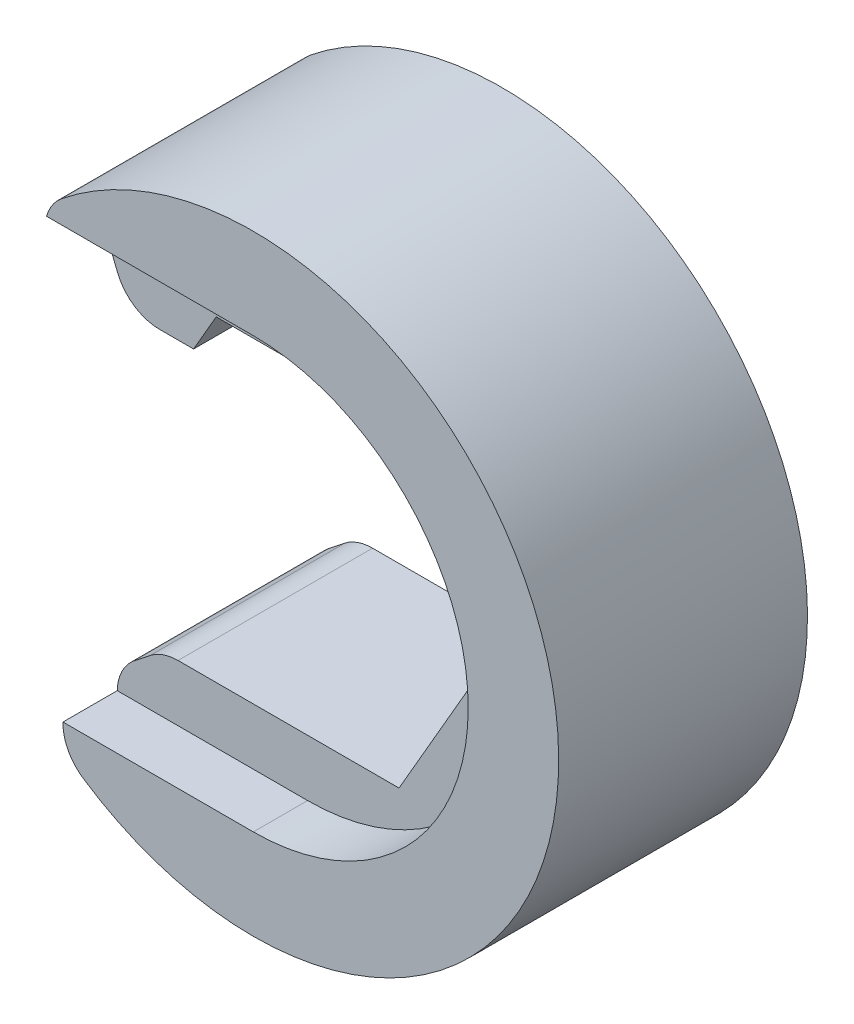
ISO-10303-21;
HEADER;
FILE_DESCRIPTION(('STEP AP214'),'2;1');
FILE_NAME('part.step','',(''),(''),'','','');
FILE_SCHEMA(('AUTOMOTIVE_DESIGN { 1 0 10303 214 1 1 1 1 }'));
ENDSEC;
DATA;
#1=APPLICATION_CONTEXT('core data for automotive mechanical design processes');
#2=APPLICATION_PROTOCOL_DEFINITION('international standard','automotive_design',2000,#1);
#3=PRODUCT_CONTEXT('',#1,'mechanical');
#4=PRODUCT('Part','Part','',(#3));
#5=PRODUCT_RELATED_PRODUCT_CATEGORY('part','',(#4));
#6=PRODUCT_DEFINITION_FORMATION('','',#4);
#7=PRODUCT_DEFINITION_CONTEXT('part definition',#1,'design');
#8=PRODUCT_DEFINITION('design','',#6,#7);
#9=PRODUCT_DEFINITION_SHAPE('','',#8);
#10=(LENGTH_UNIT() NAMED_UNIT(*) SI_UNIT(.MILLI.,.METRE.));
#11=(NAMED_UNIT(*) PLANE_ANGLE_UNIT() SI_UNIT($,.RADIAN.));
#12=(NAMED_UNIT(*) SI_UNIT($,.STERADIAN.) SOLID_ANGLE_UNIT());
#13=UNCERTAINTY_MEASURE_WITH_UNIT(LENGTH_MEASURE(1.E-05),#10,'distance_accuracy_value','');
#14=(GEOMETRIC_REPRESENTATION_CONTEXT(3) GLOBAL_UNCERTAINTY_ASSIGNED_CONTEXT((#13)) GLOBAL_UNIT_ASSIGNED_CONTEXT((#10,
#11,#12)) REPRESENTATION_CONTEXT('',''));
#15=CARTESIAN_POINT('',(0.,0.,0.));
#16=DIRECTION('',(0.,0.,1.));
#17=DIRECTION('',(1.,0.,0.));
#18=AXIS2_PLACEMENT_3D('',#15,#16,#17);
#19=CARTESIAN_POINT('',(-2.50571573989456,-0.998277955445095,4.3));
#20=DIRECTION('',(0.928988249422823,0.370109216899982,0.));
#21=DIRECTION('',(-0.370109216899982,0.928988249422823,0.));
#22=AXIS2_PLACEMENT_3D('',#19,#20,#21);
#23=PLANE('',#22);
#24=DIRECTION('',(0.370109216899982,-0.928988249422823,0.));
#25=VECTOR('',#24,1.);
#26=CARTESIAN_POINT('',(-2.50571573989456,-0.998277955445095,0.));
#27=LINE('',#26,#25);
#28=CARTESIAN_POINT('',(-4.53902162152533,4.10539735245127,0.));
#29=VERTEX_POINT('',#28);
#30=CARTESIAN_POINT('',(-4.20375501318334,3.26386537931558,0.));
#31=VERTEX_POINT('',#30);
#32=EDGE_CURVE('E164',#29,#31,#27,.T.);
#33=ORIENTED_EDGE('',*,*,#32,.T.);
#34=DIRECTION('',(0.,0.,-1.));
#35=VECTOR('',#34,1.);
#36=CARTESIAN_POINT('',(-4.20375501318334,3.26386537931558,4.3));
#37=LINE('',#36,#35);
#38=CARTESIAN_POINT('',(-4.20375501318334,3.26386537931558,4.3));
#39=VERTEX_POINT('',#38);
#40=EDGE_CURVE('E271',#31,#39,#37,.F.);
#41=ORIENTED_EDGE('',*,*,#40,.T.);
#42=DIRECTION('',(0.370109216899982,-0.928988249422823,0.));
#43=VECTOR('',#42,1.);
#44=CARTESIAN_POINT('',(-2.50571573989456,-0.998277955445095,4.3));
#45=LINE('',#44,#43);
#46=CARTESIAN_POINT('',(-4.53902162152533,4.10539735245127,4.3));
#47=VERTEX_POINT('',#46);
#48=EDGE_CURVE('E187',#47,#39,#45,.T.);
#49=ORIENTED_EDGE('',*,*,#48,.F.);
#50=DIRECTION('',(0.,0.,-1.));
#51=VECTOR('',#50,1.);
#52=CARTESIAN_POINT('',(-4.53902162152533,4.10539735245127,4.3));
#53=LINE('',#52,#51);
#54=EDGE_CURVE('E268',#47,#29,#53,.T.);
#55=ORIENTED_EDGE('',*,*,#54,.T.);
#56=EDGE_LOOP('',(#33,#41,#49,#55));
#57=FACE_BOUND('',#56,.T.);
#58=ADVANCED_FACE('F36',(#57),#23,.F.);
#59=CARTESIAN_POINT('',(0.,2.63397459621556,4.3));
#60=DIRECTION('',(0.,-1.,0.));
#61=DIRECTION('',(0.,0.,-1.));
#62=AXIS2_PLACEMENT_3D('',#59,#60,#61);
#63=PLANE('',#62);
#64=DIRECTION('',(-1.,0.,0.));
#65=VECTOR('',#64,1.);
#66=CARTESIAN_POINT('',(0.,2.63397459621556,4.3));
#67=LINE('',#66,#65);
#68=CARTESIAN_POINT('',(-2.52072594216372,2.63397459621556,4.3));
#69=VERTEX_POINT('',#68);
#70=CARTESIAN_POINT('',(-3.27476676376052,2.63397459621556,4.3));
#71=VERTEX_POINT('',#70);
#72=EDGE_CURVE('E190',#69,#71,#67,.T.);
#73=ORIENTED_EDGE('',*,*,#72,.T.);
#74=DIRECTION('',(0.,0.,-1.));
#75=VECTOR('',#74,1.);
#76=CARTESIAN_POINT('',(-3.27476676376052,2.63397459621556,0.));
#77=LINE('',#76,#75);
#78=CARTESIAN_POINT('',(-3.27476676376052,2.63397459621556,0.));
#79=VERTEX_POINT('',#78);
#80=EDGE_CURVE('E265',#71,#79,#77,.T.);
#81=ORIENTED_EDGE('',*,*,#80,.T.);
#82=DIRECTION('',(-1.,0.,0.));
#83=VECTOR('',#82,1.);
#84=CARTESIAN_POINT('',(0.,2.63397459621556,0.));
#85=LINE('',#84,#83);
#86=CARTESIAN_POINT('',(-2.52072594216372,2.63397459621556,0.));
#87=VERTEX_POINT('',#86);
#88=EDGE_CURVE('E213',#87,#79,#85,.T.);
#89=ORIENTED_EDGE('',*,*,#88,.F.);
#90=DIRECTION('',(0.,0.,-1.));
#91=VECTOR('',#90,1.);
#92=CARTESIAN_POINT('',(-2.52072594216372,2.63397459621556,4.3));
#93=LINE('',#92,#91);
#94=EDGE_CURVE('E240',#69,#87,#93,.T.);
#95=ORIENTED_EDGE('',*,*,#94,.F.);
#96=EDGE_LOOP('',(#73,#81,#89,#95));
#97=FACE_BOUND('',#96,.T.);
#98=ADVANCED_FACE('F305',(#97),#63,.T.);
#99=CARTESIAN_POINT('',(-3.03108891324555,1.75000000000003,4.3));
#100=DIRECTION('',(0.866025403784436,-0.500000000000004,0.));
#101=DIRECTION('',(0.500000000000004,0.866025403784436,0.));
#102=AXIS2_PLACEMENT_3D('',#99,#100,#101);
#103=PLANE('',#102);
#104=DIRECTION('',(-0.500000000000004,-0.866025403784436,0.));
#105=VECTOR('',#104,1.);
#106=CARTESIAN_POINT('',(-3.03108891324555,1.75000000000003,0.));
#107=LINE('',#106,#105);
#108=CARTESIAN_POINT('',(-2.02072594216371,3.5,0.));
#109=VERTEX_POINT('',#108);
#110=EDGE_CURVE('E216',#109,#87,#107,.T.);
#111=ORIENTED_EDGE('',*,*,#110,.F.);
#112=DIRECTION('',(0.,0.,-1.));
#113=VECTOR('',#112,1.);
#114=CARTESIAN_POINT('',(-2.02072594216371,3.5,4.3));
#115=LINE('',#114,#113);
#116=CARTESIAN_POINT('',(-2.02072594216371,3.5,4.3));
#117=VERTEX_POINT('',#116);
#118=EDGE_CURVE('E238',#117,#109,#115,.T.);
#119=ORIENTED_EDGE('',*,*,#118,.F.);
#120=DIRECTION('',(-0.500000000000004,-0.866025403784436,0.));
#121=VECTOR('',#120,1.);
#122=CARTESIAN_POINT('',(-3.03108891324555,1.75000000000003,4.3));
#123=LINE('',#122,#121);
#124=EDGE_CURVE('E193',#117,#69,#123,.T.);
#125=ORIENTED_EDGE('',*,*,#124,.T.);
#126=ORIENTED_EDGE('',*,*,#94,.T.);
#127=EDGE_LOOP('',(#111,#119,#125,#126));
#128=FACE_BOUND('',#127,.T.);
#129=ADVANCED_FACE('F310',(#128),#103,.T.);
#130=CARTESIAN_POINT('',(0.,3.5,4.3));
#131=DIRECTION('',(0.,1.,0.));
#132=DIRECTION('',(0.,0.,1.));
#133=AXIS2_PLACEMENT_3D('',#130,#131,#132);
#134=PLANE('',#133);
#135=DIRECTION('',(1.,0.,0.));
#136=VECTOR('',#135,1.);
#137=CARTESIAN_POINT('',(0.,3.5,0.));
#138=LINE('',#137,#136);
#139=CARTESIAN_POINT('',(2.02072594216368,3.5,0.));
#140=VERTEX_POINT('',#139);
#141=EDGE_CURVE('E219',#109,#140,#138,.T.);
#142=ORIENTED_EDGE('',*,*,#141,.T.);
#143=DIRECTION('',(0.,0.,-1.));
#144=VECTOR('',#143,1.);
#145=CARTESIAN_POINT('',(2.02072594216368,3.5,4.3));
#146=LINE('',#145,#144);
#147=CARTESIAN_POINT('',(2.02072594216368,3.5,4.3));
#148=VERTEX_POINT('',#147);
#149=EDGE_CURVE('E235',#148,#140,#146,.T.);
#150=ORIENTED_EDGE('',*,*,#149,.F.);
#151=DIRECTION('',(1.,0.,0.));
#152=VECTOR('',#151,1.);
#153=CARTESIAN_POINT('',(0.,3.5,4.3));
#154=LINE('',#153,#152);
#155=EDGE_CURVE('E196',#117,#148,#154,.T.);
#156=ORIENTED_EDGE('',*,*,#155,.F.);
#157=ORIENTED_EDGE('',*,*,#118,.T.);
#158=EDGE_LOOP('',(#142,#150,#156,#157));
#159=FACE_BOUND('',#158,.T.);
#160=ADVANCED_FACE('F315',(#159),#134,.F.);
#161=CARTESIAN_POINT('',(3.03108891324552,1.74999999999999,4.3));
#162=DIRECTION('',(0.866025403784439,0.499999999999998,0.));
#163=DIRECTION('',(-0.499999999999998,0.86602540378444,0.));
#164=AXIS2_PLACEMENT_3D('',#161,#162,#163);
#165=PLANE('',#164);
#166=DIRECTION('',(0.499999999999998,-0.86602540378444,0.));
#167=VECTOR('',#166,1.);
#168=CARTESIAN_POINT('',(3.03108891324552,1.74999999999999,0.));
#169=LINE('',#168,#167);
#170=CARTESIAN_POINT('',(4.04145188432736,0.,0.));
#171=VERTEX_POINT('',#170);
#172=EDGE_CURVE('E221',#140,#171,#169,.T.);
#173=ORIENTED_EDGE('',*,*,#172,.T.);
#174=DIRECTION('',(0.,0.,-1.));
#175=VECTOR('',#174,1.);
#176=CARTESIAN_POINT('',(4.04145188432736,0.,4.3));
#177=LINE('',#176,#175);
#178=CARTESIAN_POINT('',(4.04145188432736,0.,4.3));
#179=VERTEX_POINT('',#178);
#180=EDGE_CURVE('E232',#179,#171,#177,.T.);
#181=ORIENTED_EDGE('',*,*,#180,.F.);
#182=DIRECTION('',(0.499999999999998,-0.86602540378444,0.));
#183=VECTOR('',#182,1.);
#184=CARTESIAN_POINT('',(3.03108891324552,1.74999999999999,4.3));
#185=LINE('',#184,#183);
#186=EDGE_CURVE('E198',#148,#179,#185,.T.);
#187=ORIENTED_EDGE('',*,*,#186,.F.);
#188=ORIENTED_EDGE('',*,*,#149,.T.);
#189=EDGE_LOOP('',(#173,#181,#187,#188));
#190=FACE_BOUND('',#189,.T.);
#191=ADVANCED_FACE('F321',(#190),#165,.F.);
#192=CARTESIAN_POINT('',(3.0310889132455,-1.75,4.3));
#193=DIRECTION('',(0.866025403784436,-0.500000000000004,0.));
#194=DIRECTION('',(0.500000000000004,0.866025403784436,0.));
#195=AXIS2_PLACEMENT_3D('',#192,#193,#194);
#196=PLANE('',#195);
#197=DIRECTION('',(-0.500000000000004,-0.866025403784436,0.));
#198=VECTOR('',#197,1.);
#199=CARTESIAN_POINT('',(3.0310889132455,-1.75,0.));
#200=LINE('',#199,#198);
#201=CARTESIAN_POINT('',(2.02072594216368,-3.49999999999994,0.));
#202=VERTEX_POINT('',#201);
#203=EDGE_CURVE('E223',#171,#202,#200,.T.);
#204=ORIENTED_EDGE('',*,*,#203,.T.);
#205=DIRECTION('',(0.,0.,-1.));
#206=VECTOR('',#205,1.);
#207=CARTESIAN_POINT('',(2.02072594216368,-3.49999999999994,4.3));
#208=LINE('',#207,#206);
#209=CARTESIAN_POINT('',(2.02072594216368,-3.49999999999994,4.3));
#210=VERTEX_POINT('',#209);
#211=EDGE_CURVE('E210',#210,#202,#208,.T.);
#212=ORIENTED_EDGE('',*,*,#211,.F.);
#213=DIRECTION('',(-0.500000000000004,-0.866025403784436,0.));
#214=VECTOR('',#213,1.);
#215=CARTESIAN_POINT('',(3.0310889132455,-1.75,4.3));
#216=LINE('',#215,#214);
#217=EDGE_CURVE('E200',#179,#210,#216,.T.);
#218=ORIENTED_EDGE('',*,*,#217,.F.);
#219=ORIENTED_EDGE('',*,*,#180,.T.);
#220=EDGE_LOOP('',(#204,#212,#218,#219));
#221=FACE_BOUND('',#220,.T.);
#222=ADVANCED_FACE('F325',(#221),#196,.F.);
#223=CARTESIAN_POINT('',(0.,-3.49999999999994,4.3));
#224=DIRECTION('',(0.,-1.,0.));
#225=DIRECTION('',(0.,0.,-1.));
#226=AXIS2_PLACEMENT_3D('',#223,#224,#225);
#227=PLANE('',#226);
#228=DIRECTION('',(-1.,0.,0.));
#229=VECTOR('',#228,1.);
#230=CARTESIAN_POINT('',(0.,-3.49999999999994,0.));
#231=LINE('',#230,#229);
#232=CARTESIAN_POINT('',(-2.86435037804561,-3.49999999999994,0.));
#233=VERTEX_POINT('',#232);
#234=EDGE_CURVE('E225',#202,#233,#231,.T.);
#235=ORIENTED_EDGE('',*,*,#234,.T.);
#236=DIRECTION('',(0.,0.,-1.));
#237=VECTOR('',#236,1.);
#238=CARTESIAN_POINT('',(-2.86435037804561,-3.49999999999994,4.3));
#239=LINE('',#238,#237);
#240=CARTESIAN_POINT('',(-2.86435037804561,-3.49999999999994,4.3));
#241=VERTEX_POINT('',#240);
#242=EDGE_CURVE('E255',#233,#241,#239,.F.);
#243=ORIENTED_EDGE('',*,*,#242,.T.);
#244=DIRECTION('',(-1.,0.,0.));
#245=VECTOR('',#244,1.);
#246=CARTESIAN_POINT('',(0.,-3.49999999999994,4.3));
#247=LINE('',#246,#245);
#248=EDGE_CURVE('E202',#210,#241,#247,.T.);
#249=ORIENTED_EDGE('',*,*,#248,.F.);
#250=ORIENTED_EDGE('',*,*,#211,.T.);
#251=EDGE_LOOP('',(#235,#243,#249,#250));
#252=FACE_BOUND('',#251,.T.);
#253=ADVANCED_FACE('F329',(#252),#227,.F.);
#254=CARTESIAN_POINT('',(0.470051572764121,-0.59584616497137,4.3));
#255=DIRECTION('',(0.619357471675702,-0.785109114887531,0.));
#256=DIRECTION('',(0.785109114887531,0.619357471675702,0.));
#257=AXIS2_PLACEMENT_3D('',#254,#255,#256);
#258=PLANE('',#257);
#259=DIRECTION('',(-0.785109114887531,-0.619357471675702,0.));
#260=VECTOR('',#259,1.);
#261=CARTESIAN_POINT('',(0.470051572764121,-0.59584616497137,4.3));
#262=LINE('',#261,#260);
#263=CARTESIAN_POINT('',(-3.48370784972131,-3.71489088511241,4.3));
#264=VERTEX_POINT('',#263);
#265=CARTESIAN_POINT('',(-3.82792073058954,-3.98643380261286,4.3));
#266=VERTEX_POINT('',#265);
#267=EDGE_CURVE('E205',#264,#266,#262,.T.);
#268=ORIENTED_EDGE('',*,*,#267,.F.);
#269=DIRECTION('',(0.,0.,-1.));
#270=VECTOR('',#269,1.);
#271=CARTESIAN_POINT('',(-3.48370784972131,-3.71489088511241,4.3));
#272=LINE('',#271,#270);
#273=CARTESIAN_POINT('',(-3.48370784972131,-3.71489088511241,0.));
#274=VERTEX_POINT('',#273);
#275=EDGE_CURVE('E244',#264,#274,#272,.T.);
#276=ORIENTED_EDGE('',*,*,#275,.T.);
#277=DIRECTION('',(-0.785109114887531,-0.619357471675702,0.));
#278=VECTOR('',#277,1.);
#279=CARTESIAN_POINT('',(0.470051572764121,-0.59584616497137,0.));
#280=LINE('',#279,#278);
#281=CARTESIAN_POINT('',(-3.82792073058954,-3.98643380261286,0.));
#282=VERTEX_POINT('',#281);
#283=EDGE_CURVE('E184',#274,#282,#280,.T.);
#284=ORIENTED_EDGE('',*,*,#283,.T.);
#285=DIRECTION('',(0.,0.,-1.));
#286=VECTOR('',#285,1.);
#287=CARTESIAN_POINT('',(-3.82792073058954,-3.98643380261286,4.3));
#288=LINE('',#287,#286);
#289=EDGE_CURVE('E242',#282,#266,#288,.F.);
#290=ORIENTED_EDGE('',*,*,#289,.T.);
#291=EDGE_LOOP('',(#268,#276,#284,#290));
#292=FACE_BOUND('',#291,.T.);
#293=ADVANCED_FACE('F337',(#292),#258,.F.);
#294=CARTESIAN_POINT('',(0.,0.,4.3));
#295=DIRECTION('',(0.,0.,1.));
#296=DIRECTION('',(1.,0.,0.));
#297=AXIS2_PLACEMENT_3D('',#294,#295,#296);
#298=PLANE('',#297);
#299=ORIENTED_EDGE('',*,*,#248,.T.);
#300=CARTESIAN_POINT('',(-2.86435037804561,-4.49999999999994,4.3));
#301=DIRECTION('',(0.,0.,1.));
#302=DIRECTION('',(1.,0.,0.));
#303=AXIS2_PLACEMENT_3D('',#300,#301,#302);
#304=CIRCLE('',#303,1.);
#305=EDGE_CURVE('E263',#241,#264,#304,.T.);
#306=ORIENTED_EDGE('',*,*,#305,.T.);
#307=ORIENTED_EDGE('',*,*,#267,.T.);
#308=CARTESIAN_POINT('',(-3.20856325891384,-4.77154291750039,4.3));
#309=DIRECTION('',(0.,0.,1.));
#310=DIRECTION('',(1.,0.,0.));
#311=AXIS2_PLACEMENT_3D('',#308,#309,#310);
#312=CIRCLE('',#311,1.);
#313=CARTESIAN_POINT('',(-4.20833118333709,-4.75,4.3));
#314=VERTEX_POINT('',#313);
#315=EDGE_CURVE('E257',#266,#314,#312,.T.);
#316=ORIENTED_EDGE('',*,*,#315,.T.);
#317=DIRECTION('',(-1.,0.,0.));
#318=VECTOR('',#317,1.);
#319=CARTESIAN_POINT('',(0.,-4.75,4.3));
#320=LINE('',#319,#318);
#321=CARTESIAN_POINT('',(0.,-4.75,4.3));
#322=VERTEX_POINT('',#321);
#323=EDGE_CURVE('E208',#322,#314,#320,.T.);
#324=ORIENTED_EDGE('',*,*,#323,.F.);
#325=CARTESIAN_POINT('',(0.,0.,4.3));
#326=DIRECTION('',(0.,0.,1.));
#327=DIRECTION('',(1.,0.,0.));
#328=AXIS2_PLACEMENT_3D('',#325,#326,#327);
#329=CIRCLE('',#328,4.75);
#330=CARTESIAN_POINT('',(0.,4.75,4.3));
#331=VERTEX_POINT('',#330);
#332=EDGE_CURVE('E163',#322,#331,#329,.T.);
#333=ORIENTED_EDGE('',*,*,#332,.T.);
#334=DIRECTION('',(-1.,0.,0.));
#335=VECTOR('',#334,1.);
#336=CARTESIAN_POINT('',(0.,4.75,4.3));
#337=LINE('',#336,#335);
#338=CARTESIAN_POINT('',(-4.57162234694086,4.75,4.3));
#339=VERTEX_POINT('',#338);
#340=EDGE_CURVE('E183',#331,#339,#337,.T.);
#341=ORIENTED_EDGE('',*,*,#340,.T.);
#342=CARTESIAN_POINT('',(-3.6100333721025,4.47550656935125,4.3));
#343=DIRECTION('',(0.,0.,1.));
#344=DIRECTION('',(1.,0.,0.));
#345=AXIS2_PLACEMENT_3D('',#342,#343,#344);
#346=CIRCLE('',#345,1.);
#347=EDGE_CURVE('E259',#339,#47,#346,.T.);
#348=ORIENTED_EDGE('',*,*,#347,.T.);
#349=ORIENTED_EDGE('',*,*,#48,.T.);
#350=CARTESIAN_POINT('',(-3.27476676376052,3.63397459621556,4.3));
#351=DIRECTION('',(0.,0.,1.));
#352=DIRECTION('',(1.,0.,0.));
#353=AXIS2_PLACEMENT_3D('',#350,#351,#352);
#354=CIRCLE('',#353,1.);
#355=EDGE_CURVE('E261',#39,#71,#354,.T.);
#356=ORIENTED_EDGE('',*,*,#355,.T.);
#357=ORIENTED_EDGE('',*,*,#72,.F.);
#358=ORIENTED_EDGE('',*,*,#124,.F.);
#359=ORIENTED_EDGE('',*,*,#155,.T.);
#360=ORIENTED_EDGE('',*,*,#186,.T.);
#361=ORIENTED_EDGE('',*,*,#217,.T.);
#362=EDGE_LOOP('',(#299,#306,#307,#316,#324,#333,#341,#348,#349,#356,#357,#358,#359,#360,#361));
#363=FACE_BOUND('',#362,.T.);
#364=ADVANCED_FACE('F287',(#363),#298,.T.);
#365=CARTESIAN_POINT('',(0.,0.,0.));
#366=DIRECTION('',(0.,0.,1.));
#367=DIRECTION('',(1.,0.,0.));
#368=AXIS2_PLACEMENT_3D('',#365,#366,#367);
#369=PLANE('',#368);
#370=ORIENTED_EDGE('',*,*,#283,.F.);
#371=CARTESIAN_POINT('',(-2.86435037804561,-4.49999999999994,0.));
#372=DIRECTION('',(0.,0.,1.));
#373=DIRECTION('',(1.,0.,0.));
#374=AXIS2_PLACEMENT_3D('',#371,#372,#373);
#375=CIRCLE('',#374,1.);
#376=EDGE_CURVE('E253',#274,#233,#375,.F.);
#377=ORIENTED_EDGE('',*,*,#376,.T.);
#378=ORIENTED_EDGE('',*,*,#234,.F.);
#379=ORIENTED_EDGE('',*,*,#203,.F.);
#380=ORIENTED_EDGE('',*,*,#172,.F.);
#381=ORIENTED_EDGE('',*,*,#141,.F.);
#382=ORIENTED_EDGE('',*,*,#110,.T.);
#383=ORIENTED_EDGE('',*,*,#88,.T.);
#384=CARTESIAN_POINT('',(-3.27476676376052,3.63397459621556,0.));
#385=DIRECTION('',(0.,0.,1.));
#386=DIRECTION('',(1.,0.,0.));
#387=AXIS2_PLACEMENT_3D('',#384,#385,#386);
#388=CIRCLE('',#387,1.);
#389=EDGE_CURVE('E251',#79,#31,#388,.F.);
#390=ORIENTED_EDGE('',*,*,#389,.T.);
#391=ORIENTED_EDGE('',*,*,#32,.F.);
#392=CARTESIAN_POINT('',(-3.6100333721025,4.47550656935125,0.));
#393=DIRECTION('',(0.,0.,1.));
#394=DIRECTION('',(1.,0.,0.));
#395=AXIS2_PLACEMENT_3D('',#392,#393,#394);
#396=CIRCLE('',#395,1.);
#397=CARTESIAN_POINT('',(-4.23786526290294,5.25385553793408,0.));
#398=VERTEX_POINT('',#397);
#399=EDGE_CURVE('E249',#29,#398,#396,.F.);
#400=ORIENTED_EDGE('',*,*,#399,.T.);
#401=CARTESIAN_POINT('',(0.,0.,0.));
#402=DIRECTION('',(0.,0.,1.));
#403=DIRECTION('',(1.,0.,0.));
#404=AXIS2_PLACEMENT_3D('',#401,#402,#403);
#405=CIRCLE('',#404,6.75);
#406=CARTESIAN_POINT('',(-3.76657426046407,-5.60137646837003,0.));
#407=VERTEX_POINT('',#406);
#408=EDGE_CURVE('E174',#407,#398,#405,.T.);
#409=ORIENTED_EDGE('',*,*,#408,.F.);
#410=CARTESIAN_POINT('',(-3.20856325891384,-4.77154291750039,0.));
#411=DIRECTION('',(0.,0.,1.));
#412=DIRECTION('',(1.,0.,0.));
#413=AXIS2_PLACEMENT_3D('',#410,#411,#412);
#414=CIRCLE('',#413,1.);
#415=EDGE_CURVE('E247',#407,#282,#414,.F.);
#416=ORIENTED_EDGE('',*,*,#415,.T.);
#417=EDGE_LOOP('',(#370,#377,#378,#379,#380,#381,#382,#383,#390,#391,#400,#409,#416));
#418=FACE_BOUND('',#417,.T.);
#419=ADVANCED_FACE('F297',(#418),#369,.F.);
#420=CARTESIAN_POINT('',(0.,0.,5.5));
#421=DIRECTION('',(0.,0.,-1.));
#422=DIRECTION('',(-1.,0.,0.));
#423=AXIS2_PLACEMENT_3D('',#420,#421,#422);
#424=CYLINDRICAL_SURFACE('',#423,4.75);
#425=DIRECTION('',(0.,0.,-1.));
#426=VECTOR('',#425,1.);
#427=CARTESIAN_POINT('',(0.,4.75,5.5));
#428=LINE('',#427,#426);
#429=CARTESIAN_POINT('',(0.,4.75,5.5));
#430=VERTEX_POINT('',#429);
#431=EDGE_CURVE('E165',#430,#331,#428,.T.);
#432=ORIENTED_EDGE('',*,*,#431,.T.);
#433=ORIENTED_EDGE('',*,*,#332,.F.);
#434=DIRECTION('',(0.,0.,-1.));
#435=VECTOR('',#434,1.);
#436=CARTESIAN_POINT('',(0.,-4.75,5.5));
#437=LINE('',#436,#435);
#438=CARTESIAN_POINT('',(0.,-4.75,5.5));
#439=VERTEX_POINT('',#438);
#440=EDGE_CURVE('E158',#439,#322,#437,.T.);
#441=ORIENTED_EDGE('',*,*,#440,.F.);
#442=CARTESIAN_POINT('',(0.,0.,5.5));
#443=DIRECTION('',(0.,0.,1.));
#444=DIRECTION('',(1.,0.,0.));
#445=AXIS2_PLACEMENT_3D('',#442,#443,#444);
#446=CIRCLE('',#445,4.75);
#447=EDGE_CURVE('E162',#439,#430,#446,.T.);
#448=ORIENTED_EDGE('',*,*,#447,.T.);
#449=EDGE_LOOP('',(#432,#433,#441,#448));
#450=FACE_BOUND('',#449,.T.);
#451=ADVANCED_FACE('F160',(#450),#424,.F.);
#452=CARTESIAN_POINT('',(0.,-4.75,5.5));
#453=DIRECTION('',(0.,-1.,0.));
#454=DIRECTION('',(0.,0.,-1.));
#455=AXIS2_PLACEMENT_3D('',#452,#453,#454);
#456=PLANE('',#455);
#457=ORIENTED_EDGE('',*,*,#323,.T.);
#458=DIRECTION('',(0.,0.,-1.));
#459=VECTOR('',#458,1.);
#460=CARTESIAN_POINT('',(-4.20833118333709,-4.75,4.3));
#461=LINE('',#460,#459);
#462=CARTESIAN_POINT('',(-4.20833118333709,-4.75,5.5));
#463=VERTEX_POINT('',#462);
#464=EDGE_CURVE('E12',#314,#463,#461,.F.);
#465=ORIENTED_EDGE('',*,*,#464,.T.);
#466=DIRECTION('',(-1.,0.,0.));
#467=VECTOR('',#466,1.);
#468=CARTESIAN_POINT('',(0.,-4.75,5.5));
#469=LINE('',#468,#467);
#470=EDGE_CURVE('E167',#439,#463,#469,.T.);
#471=ORIENTED_EDGE('',*,*,#470,.F.);
#472=ORIENTED_EDGE('',*,*,#440,.T.);
#473=EDGE_LOOP('',(#457,#465,#471,#472));
#474=FACE_BOUND('',#473,.T.);
#475=ADVANCED_FACE('F168',(#474),#456,.F.);
#476=CARTESIAN_POINT('',(0.,0.,5.5));
#477=DIRECTION('',(0.,0.,-1.));
#478=DIRECTION('',(-1.,0.,0.));
#479=AXIS2_PLACEMENT_3D('',#476,#477,#478);
#480=CYLINDRICAL_SURFACE('',#479,6.75);
#481=ORIENTED_EDGE('',*,*,#408,.T.);
#482=DIRECTION('',(0.,0.,-1.));
#483=VECTOR('',#482,1.);
#484=CARTESIAN_POINT('',(-4.23786526290294,5.25385553793408,5.5));
#485=LINE('',#484,#483);
#486=CARTESIAN_POINT('',(-4.23786526290294,5.25385553793408,5.5));
#487=VERTEX_POINT('',#486);
#488=EDGE_CURVE('E276',#398,#487,#485,.F.);
#489=ORIENTED_EDGE('',*,*,#488,.T.);
#490=CARTESIAN_POINT('',(0.,0.,5.5));
#491=DIRECTION('',(0.,0.,1.));
#492=DIRECTION('',(1.,0.,0.));
#493=AXIS2_PLACEMENT_3D('',#490,#491,#492);
#494=CIRCLE('',#493,6.75);
#495=CARTESIAN_POINT('',(-3.76657426046407,-5.60137646837003,5.5));
#496=VERTEX_POINT('',#495);
#497=EDGE_CURVE('E170',#496,#487,#494,.T.);
#498=ORIENTED_EDGE('',*,*,#497,.F.);
#499=DIRECTION('',(0.,0.,-1.));
#500=VECTOR('',#499,1.);
#501=CARTESIAN_POINT('',(-3.76657426046407,-5.60137646837003,5.5));
#502=LINE('',#501,#500);
#503=EDGE_CURVE('E273',#496,#407,#502,.T.);
#504=ORIENTED_EDGE('',*,*,#503,.T.);
#505=EDGE_LOOP('',(#481,#489,#498,#504));
#506=FACE_BOUND('',#505,.T.);
#507=ADVANCED_FACE('F344',(#506),#480,.T.);
#508=CARTESIAN_POINT('',(0.,4.75,5.5));
#509=DIRECTION('',(0.,-1.,0.));
#510=DIRECTION('',(0.,0.,-1.));
#511=AXIS2_PLACEMENT_3D('',#508,#509,#510);
#512=PLANE('',#511);
#513=DIRECTION('',(-1.,0.,0.));
#514=VECTOR('',#513,1.);
#515=CARTESIAN_POINT('',(0.,4.75,5.5));
#516=LINE('',#515,#514);
#517=CARTESIAN_POINT('',(-4.57162234694086,4.75,5.5));
#518=VERTEX_POINT('',#517);
#519=EDGE_CURVE('E173',#430,#518,#516,.T.);
#520=ORIENTED_EDGE('',*,*,#519,.T.);
#521=DIRECTION('',(0.,0.,-1.));
#522=VECTOR('',#521,1.);
#523=CARTESIAN_POINT('',(-4.57162234694086,4.75,5.5));
#524=LINE('',#523,#522);
#525=EDGE_CURVE('E44',#518,#339,#524,.T.);
#526=ORIENTED_EDGE('',*,*,#525,.T.);
#527=ORIENTED_EDGE('',*,*,#340,.F.);
#528=ORIENTED_EDGE('',*,*,#431,.F.);
#529=EDGE_LOOP('',(#520,#526,#527,#528));
#530=FACE_BOUND('',#529,.T.);
#531=ADVANCED_FACE('F283',(#530),#512,.T.);
#532=CARTESIAN_POINT('',(0.,0.,5.5));
#533=DIRECTION('',(0.,0.,1.));
#534=DIRECTION('',(1.,0.,0.));
#535=AXIS2_PLACEMENT_3D('',#532,#533,#534);
#536=PLANE('',#535);
#537=ORIENTED_EDGE('',*,*,#497,.T.);
#538=CARTESIAN_POINT('',(-3.6100333721025,4.47550656935125,5.5));
#539=DIRECTION('',(0.,0.,1.));
#540=DIRECTION('',(1.,0.,0.));
#541=AXIS2_PLACEMENT_3D('',#538,#539,#540);
#542=CIRCLE('',#541,1.);
#543=EDGE_CURVE('E51',#487,#518,#542,.T.);
#544=ORIENTED_EDGE('',*,*,#543,.T.);
#545=ORIENTED_EDGE('',*,*,#519,.F.);
#546=ORIENTED_EDGE('',*,*,#447,.F.);
#547=ORIENTED_EDGE('',*,*,#470,.T.);
#548=CARTESIAN_POINT('',(-3.20856325891384,-4.77154291750039,5.5));
#549=DIRECTION('',(0.,0.,1.));
#550=DIRECTION('',(1.,0.,0.));
#551=AXIS2_PLACEMENT_3D('',#548,#549,#550);
#552=CIRCLE('',#551,1.);
#553=EDGE_CURVE('E278',#463,#496,#552,.T.);
#554=ORIENTED_EDGE('',*,*,#553,.T.);
#555=EDGE_LOOP('',(#537,#544,#545,#546,#547,#554));
#556=FACE_BOUND('',#555,.T.);
#557=ADVANCED_FACE('F172',(#556),#536,.T.);
#558=CARTESIAN_POINT('',(-2.86435037804561,-4.49999999999994,4.3));
#559=DIRECTION('',(0.,0.,-1.));
#560=DIRECTION('',(-1.,0.,0.));
#561=AXIS2_PLACEMENT_3D('',#558,#559,#560);
#562=CYLINDRICAL_SURFACE('',#561,1.);
#563=ORIENTED_EDGE('',*,*,#305,.F.);
#564=ORIENTED_EDGE('',*,*,#242,.F.);
#565=ORIENTED_EDGE('',*,*,#376,.F.);
#566=ORIENTED_EDGE('',*,*,#275,.F.);
#567=EDGE_LOOP('',(#563,#564,#565,#566));
#568=FACE_BOUND('',#567,.T.);
#569=ADVANCED_FACE('F335',(#568),#562,.T.);
#570=CARTESIAN_POINT('',(-3.27476676376052,3.63397459621556,4.3));
#571=DIRECTION('',(0.,0.,1.));
#572=DIRECTION('',(1.,0.,0.));
#573=AXIS2_PLACEMENT_3D('',#570,#571,#572);
#574=CYLINDRICAL_SURFACE('',#573,1.);
#575=ORIENTED_EDGE('',*,*,#355,.F.);
#576=ORIENTED_EDGE('',*,*,#40,.F.);
#577=ORIENTED_EDGE('',*,*,#389,.F.);
#578=ORIENTED_EDGE('',*,*,#80,.F.);
#579=EDGE_LOOP('',(#575,#576,#577,#578));
#580=FACE_BOUND('',#579,.T.);
#581=ADVANCED_FACE('F303',(#580),#574,.T.);
#582=CARTESIAN_POINT('',(-3.6100333721025,4.47550656935125,5.5));
#583=DIRECTION('',(0.,0.,-1.));
#584=DIRECTION('',(-1.,0.,0.));
#585=AXIS2_PLACEMENT_3D('',#582,#583,#584);
#586=CYLINDRICAL_SURFACE('',#585,1.);
#587=ORIENTED_EDGE('',*,*,#543,.F.);
#588=ORIENTED_EDGE('',*,*,#488,.F.);
#589=ORIENTED_EDGE('',*,*,#399,.F.);
#590=ORIENTED_EDGE('',*,*,#54,.F.);
#591=ORIENTED_EDGE('',*,*,#347,.F.);
#592=ORIENTED_EDGE('',*,*,#525,.F.);
#593=EDGE_LOOP('',(#587,#588,#589,#590,#591,#592));
#594=FACE_BOUND('',#593,.T.);
#595=ADVANCED_FACE('F290',(#594),#586,.T.);
#596=CARTESIAN_POINT('',(-3.20856325891384,-4.77154291750039,5.5));
#597=DIRECTION('',(0.,0.,-1.));
#598=DIRECTION('',(-1.,0.,0.));
#599=AXIS2_PLACEMENT_3D('',#596,#597,#598);
#600=CYLINDRICAL_SURFACE('',#599,1.);
#601=ORIENTED_EDGE('',*,*,#315,.F.);
#602=ORIENTED_EDGE('',*,*,#289,.F.);
#603=ORIENTED_EDGE('',*,*,#415,.F.);
#604=ORIENTED_EDGE('',*,*,#503,.F.);
#605=ORIENTED_EDGE('',*,*,#553,.F.);
#606=ORIENTED_EDGE('',*,*,#464,.F.);
#607=EDGE_LOOP('',(#601,#602,#603,#604,#605,#606));
#608=FACE_BOUND('',#607,.T.);
#609=ADVANCED_FACE('F38',(#608),#600,.T.);
#610=CLOSED_SHELL('',(#58,#98,#129,#160,#191,#222,#253,#293,#364,#419,#451,#475,#507,#531,#557,
#569,#581,#595,#609));
#611=MANIFOLD_SOLID_BREP('B2',#610);
#612=ADVANCED_BREP_SHAPE_REPRESENTATION('',(#18,#611),#14);
#613=SHAPE_DEFINITION_REPRESENTATION(#9,#612);
ENDSEC;
END-ISO-10303-21;
